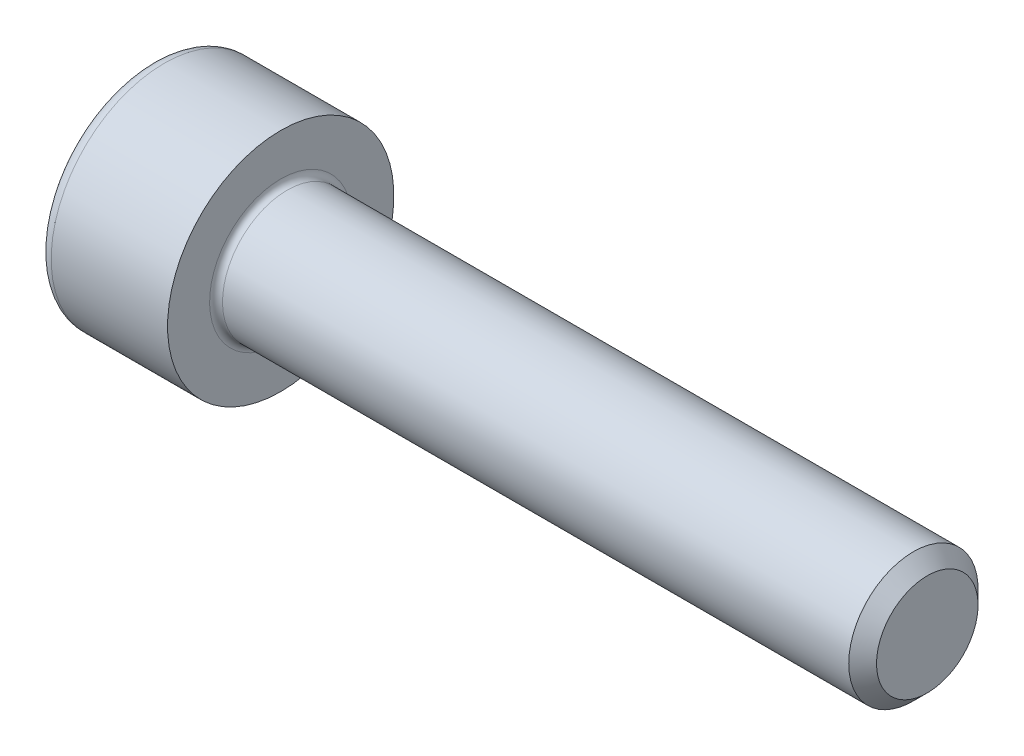
ISO-10303-21;
HEADER;
FILE_DESCRIPTION(('STEP AP214'),'2;1');
FILE_NAME('part.step','',(''),(''),'','','');
FILE_SCHEMA(('AUTOMOTIVE_DESIGN { 1 0 10303 214 1 1 1 1 }'));
ENDSEC;
DATA;
#1=APPLICATION_CONTEXT('core data for automotive mechanical design processes');
#2=APPLICATION_PROTOCOL_DEFINITION('international standard','automotive_design',2000,#1);
#3=PRODUCT_CONTEXT('',#1,'mechanical');
#4=PRODUCT('Part','Part','',(#3));
#5=PRODUCT_RELATED_PRODUCT_CATEGORY('part','',(#4));
#6=PRODUCT_DEFINITION_FORMATION('','',#4);
#7=PRODUCT_DEFINITION_CONTEXT('part definition',#1,'design');
#8=PRODUCT_DEFINITION('design','',#6,#7);
#9=PRODUCT_DEFINITION_SHAPE('','',#8);
#10=(LENGTH_UNIT() NAMED_UNIT(*) SI_UNIT(.MILLI.,.METRE.));
#11=(NAMED_UNIT(*) PLANE_ANGLE_UNIT() SI_UNIT($,.RADIAN.));
#12=(NAMED_UNIT(*) SI_UNIT($,.STERADIAN.) SOLID_ANGLE_UNIT());
#13=UNCERTAINTY_MEASURE_WITH_UNIT(LENGTH_MEASURE(1.E-05),#10,'distance_accuracy_value','');
#14=(GEOMETRIC_REPRESENTATION_CONTEXT(3) GLOBAL_UNCERTAINTY_ASSIGNED_CONTEXT((#13)) GLOBAL_UNIT_ASSIGNED_CONTEXT((#10,
#11,#12)) REPRESENTATION_CONTEXT('',''));
#15=CARTESIAN_POINT('',(0.,0.,0.));
#16=DIRECTION('',(0.,0.,1.));
#17=DIRECTION('',(1.,0.,0.));
#18=AXIS2_PLACEMENT_3D('',#15,#16,#17);
#19=CARTESIAN_POINT('',(-3.99999999999999,-1.5,0.866025403784439));
#20=DIRECTION('',(0.,-0.5,0.866025403784439));
#21=DIRECTION('',(0.,-0.866025403784439,-0.5));
#22=AXIS2_PLACEMENT_3D('',#19,#20,#21);
#23=PLANE('',#22);
#24=DIRECTION('',(1.,0.,0.));
#25=VECTOR('',#24,1.);
#26=CARTESIAN_POINT('',(-3.99999999999999,-1.5,0.866025403784438));
#27=LINE('',#26,#25);
#28=CARTESIAN_POINT('',(-1.9999999875116,-1.49999996248841,0.866025425441764));
#29=VERTEX_POINT('',#28);
#30=CARTESIAN_POINT('',(-3.99999999999999,-1.5,0.866025403784438));
#31=VERTEX_POINT('',#30);
#32=EDGE_CURVE('E80',#29,#31,#27,.F.);
#33=ORIENTED_EDGE('',*,*,#32,.T.);
#34=DIRECTION('',(0.,-0.866025403784439,-0.5));
#35=VECTOR('',#34,1.);
#36=CARTESIAN_POINT('',(-3.99999999999999,-1.5,0.866025403784439));
#37=LINE('',#36,#35);
#38=CARTESIAN_POINT('',(-3.99999999999999,0.,1.73205080756888));
#39=VERTEX_POINT('',#38);
#40=EDGE_CURVE('E92',#39,#31,#37,.T.);
#41=ORIENTED_EDGE('',*,*,#40,.F.);
#42=DIRECTION('',(1.,0.,0.));
#43=VECTOR('',#42,1.);
#44=CARTESIAN_POINT('',(-3.99999999999999,0.,1.73205080756888));
#45=LINE('',#44,#43);
#46=CARTESIAN_POINT('',(-1.99999999616734,1.1544371027462E-08,1.73205080090373));
#47=VERTEX_POINT('',#46);
#48=EDGE_CURVE('E75',#39,#47,#45,.T.);
#49=ORIENTED_EDGE('',*,*,#48,.T.);
#50=CARTESIAN_POINT('',(-2.0000000036529,-1.65452383767762E-08,1.73205077636141));
#51=CARTESIAN_POINT('',(-1.97802165551049,-0.0659159370945961,1.69399421576589));
#52=CARTESIAN_POINT('',(-1.95803350191732,-0.132400840326687,1.65560914468082));
#53=CARTESIAN_POINT('',(-1.92314478353661,-0.266521785986581,1.57817438477414));
#54=CARTESIAN_POINT('',(-1.90825655970802,-0.334160210700997,1.53912332052136));
#55=CARTESIAN_POINT('',(-1.88508196574067,-0.468598851547326,1.46150513394661));
#56=CARTESIAN_POINT('',(-1.87664133785152,-0.535378388350384,1.42294995079267));
#57=CARTESIAN_POINT('',(-1.86656687487254,-0.669251517633968,1.34565826385097));
#58=CARTESIAN_POINT('',(-1.86492469525819,-0.736344623856523,1.306922040805));
#59=CARTESIAN_POINT('',(-1.86834971897684,-0.861700886375207,1.23454756882786));
#60=CARTESIAN_POINT('',(-1.87257596506166,-0.919982853423761,1.20089845948638));
#61=CARTESIAN_POINT('',(-1.88596797480089,-1.03616709952449,1.13381945374144));
#62=CARTESIAN_POINT('',(-1.8951383086573,-1.09406897702674,1.10038978917291));
#63=CARTESIAN_POINT('',(-1.91806236794526,-1.21049257361669,1.03317259433674));
#64=CARTESIAN_POINT('',(-1.93191322160908,-1.2689995651649,0.999393567018157));
#65=CARTESIAN_POINT('',(-1.96334880368776,-1.38514116907785,0.932339180737391));
#66=CARTESIAN_POINT('',(-1.98092615073863,-1.44277726820166,0.899062963394458));
#67=CARTESIAN_POINT('',(-1.99999997500775,-1.49999992497686,0.866025447099069));
#68=B_SPLINE_CURVE_WITH_KNOTS('',3,(#50,#51,#52,#53,#54,#55,#56,#57,#58,#59,#60,#61,#62,#63,#64,
#65,#66,#67),.UNSPECIFIED.,.F.,.F.,(4,2,2,2,2,2,2,2,4),(0.,0.237762010068717,0.47609536514977,
0.708530707694851,0.940680670630639,1.14278081105053,1.34506808934202,1.55184112958895,
1.75820836194058),.UNSPECIFIED.);
#69=EDGE_CURVE('E21',#47,#29,#68,.T.);
#70=ORIENTED_EDGE('',*,*,#69,.T.);
#71=EDGE_LOOP('',(#33,#41,#49,#70));
#72=FACE_BOUND('',#71,.T.);
#73=ADVANCED_FACE('F17',(#72),#23,.F.);
#74=CARTESIAN_POINT('',(-3.99999999999999,-1.5,-0.866025403784438));
#75=DIRECTION('',(0.,-1.,0.));
#76=DIRECTION('',(0.,0.,-1.));
#77=AXIS2_PLACEMENT_3D('',#74,#75,#76);
#78=PLANE('',#77);
#79=DIRECTION('',(1.,0.,0.));
#80=VECTOR('',#79,1.);
#81=CARTESIAN_POINT('',(-3.99999999999999,-1.5,-0.866025403784441));
#82=LINE('',#81,#80);
#83=CARTESIAN_POINT('',(-1.99999998751514,-1.5,-0.866025360482052));
#84=VERTEX_POINT('',#83);
#85=CARTESIAN_POINT('',(-3.99999999999999,-1.5,-0.86602540378444));
#86=VERTEX_POINT('',#85);
#87=EDGE_CURVE('E251',#84,#86,#82,.F.);
#88=ORIENTED_EDGE('',*,*,#87,.T.);
#89=DIRECTION('',(0.,0.,-1.));
#90=VECTOR('',#89,1.);
#91=CARTESIAN_POINT('',(-3.99999999999999,-1.5,-0.866025403784438));
#92=LINE('',#91,#90);
#93=EDGE_CURVE('E91',#31,#86,#92,.T.);
#94=ORIENTED_EDGE('',*,*,#93,.F.);
#95=ORIENTED_EDGE('',*,*,#32,.F.);
#96=CARTESIAN_POINT('',(-2.00000003229821,-1.49999996249205,0.866025430549019));
#97=CARTESIAN_POINT('',(-1.97802167511814,-1.49999998652883,0.789912288388086));
#98=CARTESIAN_POINT('',(-1.95803351677338,-1.4999999963895,0.713142136383564));
#99=CARTESIAN_POINT('',(-1.92314479276488,-1.50000000361918,0.558272606729808));
#100=CARTESIAN_POINT('',(-1.90825656806336,-1.50000000095811,0.48017047824301));
#101=CARTESIAN_POINT('',(-1.88508197154335,-1.4999999990656,0.324934102626153));
#102=CARTESIAN_POINT('',(-1.87664134197457,-1.49999999975092,0.247823733904203));
#103=CARTESIAN_POINT('',(-1.86656687616511,-1.50000000024878,0.0932403557142807));
#104=CARTESIAN_POINT('',(-1.86492469540277,-1.50000000006238,0.015767907728965));
#105=CARTESIAN_POINT('',(-1.86834971730463,-1.49999999994569,-0.128981041062148));
#106=CARTESIAN_POINT('',(-1.87257596276158,-1.49999999998536,-0.196279262652278));
#107=CARTESIAN_POINT('',(-1.88596797173955,-1.50000000001465,-0.33043727989842));
#108=CARTESIAN_POINT('',(-1.89513830546149,-1.50000000000422,-0.397296611884692));
#109=CARTESIAN_POINT('',(-1.91806236493992,-1.49999999999568,-0.531731007494158));
#110=CARTESIAN_POINT('',(-1.93191321895245,-1.49999999999784,-0.599289065215861));
#111=CARTESIAN_POINT('',(-1.96334880210506,-1.50000000000215,-0.733397843892968));
#112=CARTESIAN_POINT('',(-1.98092614988199,-1.5000000000043,-0.799950281609664));
#113=CARTESIAN_POINT('',(-1.99999997501448,-1.5,-0.866025317178483));
#114=B_SPLINE_CURVE_WITH_KNOTS('',3,(#96,#97,#98,#99,#100,#101,#102,#103,#104,#105,#106,#107,
#108,#109,#110,#111,#112,#113),.UNSPECIFIED.,.F.,.F.,(4,2,2,2,2,2,2,2,4),(0.,0.237762017394818,
0.476095379541442,0.70853072814728,0.940680697255616,1.1427808461417,1.34506813284411,
1.55184118234343,1.75820842401597),.UNSPECIFIED.);
#115=EDGE_CURVE('E85',#29,#84,#114,.T.);
#116=ORIENTED_EDGE('',*,*,#115,.T.);
#117=EDGE_LOOP('',(#88,#94,#95,#116));
#118=FACE_BOUND('',#117,.T.);
#119=ADVANCED_FACE('F89',(#118),#78,.F.);
#120=CARTESIAN_POINT('',(-3.99999999999999,0.,1.73205080756888));
#121=DIRECTION('',(0.,0.500000000000001,0.866025403784438));
#122=DIRECTION('',(0.,-0.866025403784438,0.500000000000001));
#123=AXIS2_PLACEMENT_3D('',#120,#121,#122);
#124=PLANE('',#123);
#125=ORIENTED_EDGE('',*,*,#48,.F.);
#126=DIRECTION('',(0.,-0.866025403784438,0.500000000000001));
#127=VECTOR('',#126,1.);
#128=CARTESIAN_POINT('',(-3.99999999999999,0.,1.73205080756888));
#129=LINE('',#128,#127);
#130=CARTESIAN_POINT('',(-3.99999999999999,1.5,0.866025403784438));
#131=VERTEX_POINT('',#130);
#132=EDGE_CURVE('E259',#131,#39,#129,.T.);
#133=ORIENTED_EDGE('',*,*,#132,.F.);
#134=DIRECTION('',(1.,0.,0.));
#135=VECTOR('',#134,1.);
#136=CARTESIAN_POINT('',(-3.99999999999999,1.5,0.866025403784437));
#137=LINE('',#136,#135);
#138=CARTESIAN_POINT('',(-1.99999998751756,1.5,0.866025360490418));
#139=VERTEX_POINT('',#138);
#140=EDGE_CURVE('E86',#131,#139,#137,.T.);
#141=ORIENTED_EDGE('',*,*,#140,.T.);
#142=CARTESIAN_POINT('',(-2.00000003228594,1.50000000444081,0.866025357934829));
#143=CARTESIAN_POINT('',(-1.97802167510924,1.43408410176221,0.904081949829615));
#144=CARTESIAN_POINT('',(-1.95803351676374,1.36759920478545,0.942467034375812));
#145=CARTESIAN_POINT('',(-1.92314479275142,1.23347826141233,1.0199018054796));
#146=CARTESIAN_POINT('',(-1.90825656804699,1.16583983270569,1.05895286742996));
#147=CARTESIAN_POINT('',(-1.8850819715323,1.03140118688335,1.13657105360094));
#148=CARTESIAN_POINT('',(-1.87664134196848,0.964621649034505,1.17512623854522));
#149=CARTESIAN_POINT('',(-1.86656687616455,0.830748516805254,1.25241792804958));
#150=CARTESIAN_POINT('',(-1.8649246954026,0.76365540868363,1.29115415186927));
#151=CARTESIAN_POINT('',(-1.86834971741842,0.638299137651945,1.36352862855935));
#152=CARTESIAN_POINT('',(-1.87257596336653,0.580017163984809,1.39717774179075));
#153=CARTESIAN_POINT('',(-1.88596797400307,0.463832904691232,1.4642567552033));
#154=CARTESIAN_POINT('',(-1.89513830889401,0.405931020614708,1.49768642354943));
#155=CARTESIAN_POINT('',(-1.91806237128749,0.289507410593357,1.56490362612543));
#156=CARTESIAN_POINT('',(-1.93191322706717,0.231000412195435,1.59868265740244));
#157=CARTESIAN_POINT('',(-1.96334881413851,0.11485879478155,1.66573705148544));
#158=CARTESIAN_POINT('',(-1.98092616406467,0.0572226890061457,1.69901327267239));
#159=CARTESIAN_POINT('',(-1.99999999145816,2.56719139976172E-08,1.73205079274719));
#160=B_SPLINE_CURVE_WITH_KNOTS('',3,(#142,#143,#144,#145,#146,#147,#148,#149,#150,#151,#152,
#153,#154,#155,#156,#157,#158,#159),.UNSPECIFIED.,.F.,.F.,(4,2,2,2,2,2,2,2,4),(0.,
0.237762017448861,0.47609537965735,0.708530728202091,0.940680697243783,1.14278086056226,
1.34506816175055,1.55184122648755,1.75820848328163),.UNSPECIFIED.);
#161=EDGE_CURVE('E122',#139,#47,#160,.T.);
#162=ORIENTED_EDGE('',*,*,#161,.T.);
#163=EDGE_LOOP('',(#125,#133,#141,#162));
#164=FACE_BOUND('',#163,.T.);
#165=ADVANCED_FACE('F115',(#164),#124,.F.);
#166=CARTESIAN_POINT('',(-3.99999999999999,0.,-1.73205080756888));
#167=DIRECTION('',(0.,-0.5,-0.866025403784439));
#168=DIRECTION('',(0.,0.866025403784439,-0.5));
#169=AXIS2_PLACEMENT_3D('',#166,#167,#168);
#170=PLANE('',#169);
#171=DIRECTION('',(1.,0.,0.));
#172=VECTOR('',#171,1.);
#173=CARTESIAN_POINT('',(-3.99999999999999,0.,-1.73205080756888));
#174=LINE('',#173,#172);
#175=CARTESIAN_POINT('',(-1.99999999231927,-5.19153402602735E-08,-1.73205079423868));
#176=VERTEX_POINT('',#175);
#177=CARTESIAN_POINT('',(-3.99999999999999,0.,-1.73205080756888));
#178=VERTEX_POINT('',#177);
#179=EDGE_CURVE('E127',#176,#178,#174,.F.);
#180=ORIENTED_EDGE('',*,*,#179,.T.);
#181=DIRECTION('',(0.,0.866025403784439,-0.5));
#182=VECTOR('',#181,1.);
#183=CARTESIAN_POINT('',(-3.99999999999999,0.,-1.73205080756888));
#184=LINE('',#183,#182);
#185=EDGE_CURVE('E40',#86,#178,#184,.T.);
#186=ORIENTED_EDGE('',*,*,#185,.F.);
#187=ORIENTED_EDGE('',*,*,#87,.F.);
#188=CARTESIAN_POINT('',(-2.0000000322865,-1.50000000440859,-0.86602535793755));
#189=CARTESIAN_POINT('',(-1.97802167511012,-1.43408410175135,-0.904081949830185));
#190=CARTESIAN_POINT('',(-1.95803351676731,-1.36759920479283,-0.942467034370029));
#191=CARTESIAN_POINT('',(-1.92314479276111,-1.2334782614559,-1.01990180545598));
#192=CARTESIAN_POINT('',(-1.90825656805995,-1.16583983276724,-1.05895286739483));
#193=CARTESIAN_POINT('',(-1.88508197154098,-1.03140118694701,-1.13657105356379));
#194=CARTESIAN_POINT('',(-1.87664134197288,-0.964621649081852,-1.17512623851778));
#195=CARTESIAN_POINT('',(-1.86656687616458,-0.83074851681681,-1.25241792804302));
#196=CARTESIAN_POINT('',(-1.86492469540271,-0.763655408675709,-1.29115415187387));
#197=CARTESIAN_POINT('',(-1.86834971730531,-0.638299141795081,-1.36352862616728));
#198=CARTESIAN_POINT('',(-1.8725759627625,-0.58001717228952,-1.39717773699602));
#199=CARTESIAN_POINT('',(-1.88596797174072,-0.463832921249992,-1.4642567456431));
#200=CARTESIAN_POINT('',(-1.89513830546267,-0.405931041265777,-1.49768641162654));
#201=CARTESIAN_POINT('',(-1.91806236494091,-0.289507439523717,-1.56490360942248));
#202=CARTESIAN_POINT('',(-1.93191321895324,-0.231000445308716,-1.59868263828448));
#203=CARTESIAN_POINT('',(-1.96334880210526,-0.114858836108465,-1.66573702762534));
#204=CARTESIAN_POINT('',(-1.9809261498818,-0.0572227343643234,-1.69901324648484));
#205=CARTESIAN_POINT('',(-1.99999997501386,-7.50048201940328E-08,-1.73205076426483));
#206=B_SPLINE_CURVE_WITH_KNOTS('',3,(#188,#189,#190,#191,#192,#193,#194,#195,#196,#197,#198,
#199,#200,#201,#202,#203,#204,#205),.UNSPECIFIED.,.F.,.F.,(4,2,2,2,2,2,2,2,4),(0.,
0.23776201739182,0.476095379535552,0.708530728138914,0.940680697244729,1.14278084612681,
1.34506813282524,1.55184118232019,1.75820842398835),.UNSPECIFIED.);
#207=EDGE_CURVE('E98',#84,#176,#206,.T.);
#208=ORIENTED_EDGE('',*,*,#207,.T.);
#209=EDGE_LOOP('',(#180,#186,#187,#208));
#210=FACE_BOUND('',#209,.T.);
#211=ADVANCED_FACE('F118',(#210),#170,.F.);
#212=CARTESIAN_POINT('',(-3.99999999999999,1.5,0.866025403784437));
#213=DIRECTION('',(0.,1.,0.));
#214=DIRECTION('',(0.,0.,1.));
#215=AXIS2_PLACEMENT_3D('',#212,#213,#214);
#216=PLANE('',#215);
#217=ORIENTED_EDGE('',*,*,#140,.F.);
#218=DIRECTION('',(0.,0.,1.));
#219=VECTOR('',#218,1.);
#220=CARTESIAN_POINT('',(-3.99999999999999,1.5,0.866025403784437));
#221=LINE('',#220,#219);
#222=CARTESIAN_POINT('',(-3.99999999999999,1.5,-0.86602540378444));
#223=VERTEX_POINT('',#222);
#224=EDGE_CURVE('E241',#223,#131,#221,.T.);
#225=ORIENTED_EDGE('',*,*,#224,.F.);
#226=DIRECTION('',(1.,0.,0.));
#227=VECTOR('',#226,1.);
#228=CARTESIAN_POINT('',(-3.99999999999999,1.5,-0.86602540378444));
#229=LINE('',#228,#227);
#230=CARTESIAN_POINT('',(-2.00000000001484,1.5,-0.866025403782285));
#231=VERTEX_POINT('',#230);
#232=EDGE_CURVE('E228',#223,#231,#229,.T.);
#233=ORIENTED_EDGE('',*,*,#232,.T.);
#234=CARTESIAN_POINT('',(-2.00000000001257,1.50000000000273,-0.866025403780606));
#235=CARTESIAN_POINT('',(-1.97802165886293,1.50000000000098,-0.789912260493061));
#236=CARTESIAN_POINT('',(-1.95803350784681,1.50000000000026,-0.713142109635523));
#237=CARTESIAN_POINT('',(-1.92314479057624,1.49999999999973,-0.558272584114995));
#238=CARTESIAN_POINT('',(-1.90825656528006,1.49999999999993,-0.480170458616052));
#239=CARTESIAN_POINT('',(-1.88508196922304,1.50000000000007,-0.324934088047349));
#240=CARTESIAN_POINT('',(-1.87664134070256,1.50000000000002,-0.247823721391418));
#241=CARTESIAN_POINT('',(-1.86656687609283,1.49999999999998,-0.0932403476176745));
#242=CARTESIAN_POINT('',(-1.86492469547459,1.49999999999999,-0.0157679019828527));
#243=CARTESIAN_POINT('',(-1.86834971743715,1.5,0.12898104429369));
#244=CARTESIAN_POINT('',(-1.87257596298732,1.5,0.196279265710841));
#245=CARTESIAN_POINT('',(-1.88596797209475,1.5,0.330437282658472));
#246=CARTESIAN_POINT('',(-1.89513830585714,1.5,0.397296614518769));
#247=CARTESIAN_POINT('',(-1.91806236535705,1.5,0.531731009618976));
#248=CARTESIAN_POINT('',(-1.93191321933312,1.5,0.59928906696045));
#249=CARTESIAN_POINT('',(-1.96334880234726,1.5,0.733397844805802));
#250=CARTESIAN_POINT('',(-1.98092615001771,1.5,0.799950282072011));
#251=CARTESIAN_POINT('',(-1.99999997501965,1.5,0.866025317196399));
#252=B_SPLINE_CURVE_WITH_KNOTS('',3,(#234,#235,#236,#237,#238,#239,#240,#241,#242,#243,#244,
#245,#246,#247,#248,#249,#250,#251),.UNSPECIFIED.,.F.,.F.,(4,2,2,2,2,2,2,2,4),(0.,
0.237762008585654,0.476095362595392,0.708530704532813,0.940680666692571,1.14278081505591,
1.3450681014095,1.55184114976991,1.75820839005551),.UNSPECIFIED.);
#253=EDGE_CURVE('E99',#231,#139,#252,.T.);
#254=ORIENTED_EDGE('',*,*,#253,.T.);
#255=EDGE_LOOP('',(#217,#225,#233,#254));
#256=FACE_BOUND('',#255,.T.);
#257=ADVANCED_FACE('F137',(#256),#216,.F.);
#258=CARTESIAN_POINT('',(-2.00599999993756,0.,0.));
#259=DIRECTION('',(-1.,0.,0.));
#260=DIRECTION('',(0.,0.,1.));
#261=AXIS2_PLACEMENT_3D('',#258,#259,#260);
#262=CONICAL_SURFACE('',#261,1.74244311227767,1.04719755112663);
#263=CARTESIAN_POINT('',(-0.999999999976353,-5.6843418860808E-11,0.));
#264=VERTEX_POINT('',#263);
#265=VERTEX_LOOP('',#264);
#266=FACE_BOUND('',#265,.T.);
#267=ORIENTED_EDGE('',*,*,#253,.F.);
#268=CARTESIAN_POINT('',(-2.00000000001422,1.49999999999627,-0.866025403786596));
#269=CARTESIAN_POINT('',(-1.97802165885292,1.43408408431542,-0.904081975448814));
#270=CARTESIAN_POINT('',(-1.95803350782755,1.36759918338794,-0.942467050896341));
#271=CARTESIAN_POINT('',(-1.92314479054351,1.23347823994494,-1.01990181369712));
#272=CARTESIAN_POINT('',(-1.90825656524344,1.16583981513555,-1.05895287646838));
#273=CARTESIAN_POINT('',(-1.88508196919891,1.03140117462586,-1.13657106175614));
#274=CARTESIAN_POINT('',(-1.8766413406883,0.964621638239401,-1.17512624506522));
#275=CARTESIAN_POINT('',(-1.86656687609048,0.830748509619987,-1.2524179319109));
#276=CARTESIAN_POINT('',(-1.86492469547398,0.763655403645579,-1.29115415470599));
#277=CARTESIAN_POINT('',(-1.8683497176662,0.638299130702508,-1.36352863263428));
#278=CARTESIAN_POINT('',(-1.87257596419906,0.580017153008408,-1.39717774814487));
#279=CARTESIAN_POINT('',(-1.88596797662375,0.463832885713951,-1.46425676614293));
#280=CARTESIAN_POINT('',(-1.89513831272391,0.40593099766408,-1.49768643679511));
#281=CARTESIAN_POINT('',(-1.91806237805289,0.289507379817978,-1.56490364389859));
#282=CARTESIAN_POINT('',(-1.93191323556249,0.231000377569928,-1.59868267739598));
#283=CARTESIAN_POINT('',(-1.96334882641215,0.114858752669525,-1.66573707579634));
#284=CARTESIAN_POINT('',(-1.98092617837992,0.0572226432562808,-1.69901329908112));
#285=CARTESIAN_POINT('',(-2.00000000790258,-2.36613446850149E-08,-1.73205082122976));
#286=B_SPLINE_CURVE_WITH_KNOTS('',3,(#268,#269,#270,#271,#272,#273,#274,#275,#276,#277,#278,
#279,#280,#281,#282,#283,#284,#285),.UNSPECIFIED.,.F.,.F.,(4,2,2,2,2,2,2,2,4),(0.,
0.237762008701382,0.476095362841596,0.708530704662099,0.940680666694218,1.14278084391053,
1.34506815922383,1.55184123804786,1.75820850856515),.UNSPECIFIED.);
#287=EDGE_CURVE('E128',#231,#176,#286,.T.);
#288=ORIENTED_EDGE('',*,*,#287,.T.);
#289=ORIENTED_EDGE('',*,*,#207,.F.);
#290=ORIENTED_EDGE('',*,*,#115,.F.);
#291=ORIENTED_EDGE('',*,*,#69,.F.);
#292=ORIENTED_EDGE('',*,*,#161,.F.);
#293=EDGE_LOOP('',(#267,#288,#289,#290,#291,#292));
#294=FACE_BOUND('',#293,.T.);
#295=ADVANCED_FACE('F96',(#266,#294),#262,.F.);
#296=CARTESIAN_POINT('',(-3.99999999999999,1.5,-0.86602540378444));
#297=DIRECTION('',(0.,0.5,-0.866025403784439));
#298=DIRECTION('',(0.,0.866025403784439,0.5));
#299=AXIS2_PLACEMENT_3D('',#296,#297,#298);
#300=PLANE('',#299);
#301=ORIENTED_EDGE('',*,*,#232,.F.);
#302=DIRECTION('',(0.,0.866025403784438,0.5));
#303=VECTOR('',#302,1.);
#304=CARTESIAN_POINT('',(-3.99999999999999,0.,-1.73205080756888));
#305=LINE('',#304,#303);
#306=EDGE_CURVE('E247',#178,#223,#305,.T.);
#307=ORIENTED_EDGE('',*,*,#306,.F.);
#308=ORIENTED_EDGE('',*,*,#179,.F.);
#309=ORIENTED_EDGE('',*,*,#287,.F.);
#310=EDGE_LOOP('',(#301,#307,#308,#309));
#311=FACE_BOUND('',#310,.T.);
#312=ADVANCED_FACE('F146',(#311),#300,.F.);
#313=CARTESIAN_POINT('',(-3.99999999999999,2.61602540378444,0.));
#314=DIRECTION('',(-1.,0.,0.));
#315=DIRECTION('',(0.,-1.,0.));
#316=AXIS2_PLACEMENT_3D('',#313,#314,#315);
#317=PLANE('',#316);
#318=ORIENTED_EDGE('',*,*,#185,.T.);
#319=ORIENTED_EDGE('',*,*,#306,.T.);
#320=ORIENTED_EDGE('',*,*,#224,.T.);
#321=ORIENTED_EDGE('',*,*,#132,.T.);
#322=ORIENTED_EDGE('',*,*,#40,.T.);
#323=ORIENTED_EDGE('',*,*,#93,.T.);
#324=EDGE_LOOP('',(#318,#319,#320,#321,#322,#323));
#325=FACE_BOUND('',#324,.T.);
#326=CARTESIAN_POINT('',(-3.99999999999999,0.,0.));
#327=DIRECTION('',(1.,0.,0.));
#328=DIRECTION('',(0.,1.,0.));
#329=AXIS2_PLACEMENT_3D('',#326,#327,#328);
#330=CIRCLE('',#329,3.1);
#331=CARTESIAN_POINT('',(-3.99999999999999,3.1,0.));
#332=VERTEX_POINT('',#331);
#333=EDGE_CURVE('E215',#332,#332,#330,.T.);
#334=ORIENTED_EDGE('',*,*,#333,.F.);
#335=EDGE_LOOP('',(#334));
#336=FACE_BOUND('',#335,.T.);
#337=ADVANCED_FACE('F202',(#325,#336),#317,.T.);
#338=CARTESIAN_POINT('',(-3.59999999999999,0.,0.));
#339=DIRECTION('',(1.,0.,0.));
#340=DIRECTION('',(0.,0.,-1.));
#341=AXIS2_PLACEMENT_3D('',#338,#339,#340);
#342=TOROIDAL_SURFACE('',#341,3.1,0.4);
#343=CARTESIAN_POINT('',(-3.59999999999999,0.,0.));
#344=DIRECTION('',(1.,0.,0.));
#345=DIRECTION('',(0.,1.,0.));
#346=AXIS2_PLACEMENT_3D('',#343,#344,#345);
#347=CIRCLE('',#346,3.5);
#348=CARTESIAN_POINT('',(-3.59999999999999,3.5,0.));
#349=VERTEX_POINT('',#348);
#350=EDGE_CURVE('E277',#349,#349,#347,.T.);
#351=ORIENTED_EDGE('',*,*,#350,.F.);
#352=EDGE_LOOP('',(#351));
#353=FACE_BOUND('',#352,.T.);
#354=ORIENTED_EDGE('',*,*,#333,.T.);
#355=EDGE_LOOP('',(#354));
#356=FACE_BOUND('',#355,.T.);
#357=ADVANCED_FACE('F196',(#353,#356),#342,.T.);
#358=CARTESIAN_POINT('',(-2.,0.,0.));
#359=DIRECTION('',(1.,0.,0.));
#360=DIRECTION('',(0.,1.,0.));
#361=AXIS2_PLACEMENT_3D('',#358,#359,#360);
#362=CYLINDRICAL_SURFACE('',#361,3.5);
#363=ORIENTED_EDGE('',*,*,#350,.T.);
#364=EDGE_LOOP('',(#363));
#365=FACE_BOUND('',#364,.T.);
#366=CARTESIAN_POINT('',(0.,0.,0.));
#367=DIRECTION('',(1.,0.,0.));
#368=DIRECTION('',(0.,1.,0.));
#369=AXIS2_PLACEMENT_3D('',#366,#367,#368);
#370=CIRCLE('',#369,3.5);
#371=CARTESIAN_POINT('',(0.,3.5,0.));
#372=VERTEX_POINT('',#371);
#373=EDGE_CURVE('E275',#372,#372,#370,.T.);
#374=ORIENTED_EDGE('',*,*,#373,.F.);
#375=EDGE_LOOP('',(#374));
#376=FACE_BOUND('',#375,.T.);
#377=ADVANCED_FACE('F192',(#365,#376),#362,.T.);
#378=CARTESIAN_POINT('',(20.,1.,0.));
#379=DIRECTION('',(1.,0.,0.));
#380=DIRECTION('',(0.,1.,0.));
#381=AXIS2_PLACEMENT_3D('',#378,#379,#380);
#382=PLANE('',#381);
#383=CARTESIAN_POINT('',(19.9999999999818,0.,0.));
#384=DIRECTION('',(-1.,0.,0.));
#385=DIRECTION('',(0.,0.,1.));
#386=AXIS2_PLACEMENT_3D('',#383,#384,#385);
#387=CIRCLE('',#386,1.57058500002449);
#388=CARTESIAN_POINT('',(19.9999999999818,0.,1.57058500002449));
#389=VERTEX_POINT('',#388);
#390=EDGE_CURVE('E273',#389,#389,#387,.T.);
#391=ORIENTED_EDGE('',*,*,#390,.F.);
#392=EDGE_LOOP('',(#391));
#393=FACE_BOUND('',#392,.T.);
#394=ADVANCED_FACE('F189',(#393),#382,.T.);
#395=CARTESIAN_POINT('',(0.,2.75,0.));
#396=DIRECTION('',(1.,0.,0.));
#397=DIRECTION('',(0.,1.,0.));
#398=AXIS2_PLACEMENT_3D('',#395,#396,#397);
#399=PLANE('',#398);
#400=CARTESIAN_POINT('',(0.,0.,0.));
#401=DIRECTION('',(1.,0.,0.));
#402=DIRECTION('',(0.,1.,0.));
#403=AXIS2_PLACEMENT_3D('',#400,#401,#402);
#404=CIRCLE('',#403,2.2);
#405=CARTESIAN_POINT('',(0.,2.2,0.));
#406=VERTEX_POINT('',#405);
#407=EDGE_CURVE('E176',#406,#406,#404,.F.);
#408=ORIENTED_EDGE('',*,*,#407,.T.);
#409=EDGE_LOOP('',(#408));
#410=FACE_BOUND('',#409,.T.);
#411=ORIENTED_EDGE('',*,*,#373,.T.);
#412=EDGE_LOOP('',(#411));
#413=FACE_BOUND('',#412,.T.);
#414=ADVANCED_FACE('F180',(#410,#413),#399,.T.);
#415=CARTESIAN_POINT('',(19.5705850000536,0.,0.));
#416=DIRECTION('',(-1.,0.,0.));
#417=DIRECTION('',(0.,0.,1.));
#418=AXIS2_PLACEMENT_3D('',#415,#416,#417);
#419=CONICAL_SURFACE('',#418,1.99999999995271,0.785398163397448);
#420=ORIENTED_EDGE('',*,*,#390,.T.);
#421=EDGE_LOOP('',(#420));
#422=FACE_BOUND('',#421,.T.);
#423=CARTESIAN_POINT('',(19.570585,0.,0.));
#424=DIRECTION('',(1.,0.,0.));
#425=DIRECTION('',(0.,1.,0.));
#426=AXIS2_PLACEMENT_3D('',#423,#424,#425);
#427=CIRCLE('',#426,2.);
#428=CARTESIAN_POINT('',(19.570585,2.,0.));
#429=VERTEX_POINT('',#428);
#430=EDGE_CURVE('E31',#429,#429,#427,.F.);
#431=ORIENTED_EDGE('',*,*,#430,.F.);
#432=EDGE_LOOP('',(#431));
#433=FACE_BOUND('',#432,.T.);
#434=ADVANCED_FACE('F158',(#422,#433),#419,.T.);
#435=CARTESIAN_POINT('',(0.200000000000002,0.,0.));
#436=DIRECTION('',(1.,0.,0.));
#437=DIRECTION('',(0.,0.,-1.));
#438=AXIS2_PLACEMENT_3D('',#435,#436,#437);
#439=TOROIDAL_SURFACE('',#438,2.2,0.2);
#440=CARTESIAN_POINT('',(0.200000000000002,0.,0.));
#441=DIRECTION('',(1.,0.,0.));
#442=DIRECTION('',(0.,1.,0.));
#443=AXIS2_PLACEMENT_3D('',#440,#441,#442);
#444=CIRCLE('',#443,2.);
#445=CARTESIAN_POINT('',(0.200000000000002,2.,0.));
#446=VERTEX_POINT('',#445);
#447=EDGE_CURVE('E11',#446,#446,#444,.T.);
#448=ORIENTED_EDGE('',*,*,#447,.F.);
#449=EDGE_LOOP('',(#448));
#450=FACE_BOUND('',#449,.T.);
#451=ORIENTED_EDGE('',*,*,#407,.F.);
#452=EDGE_LOOP('',(#451));
#453=FACE_BOUND('',#452,.T.);
#454=ADVANCED_FACE('F152',(#450,#453),#439,.F.);
#455=CARTESIAN_POINT('',(10.875,0.,0.));
#456=DIRECTION('',(1.,0.,0.));
#457=DIRECTION('',(0.,1.,0.));
#458=AXIS2_PLACEMENT_3D('',#455,#456,#457);
#459=CYLINDRICAL_SURFACE('',#458,2.);
#460=ORIENTED_EDGE('',*,*,#447,.T.);
#461=EDGE_LOOP('',(#460));
#462=FACE_BOUND('',#461,.T.);
#463=ORIENTED_EDGE('',*,*,#430,.T.);
#464=EDGE_LOOP('',(#463));
#465=FACE_BOUND('',#464,.T.);
#466=ADVANCED_FACE('F150',(#462,#465),#459,.T.);
#467=CLOSED_SHELL('',(#73,#119,#165,#211,#257,#295,#312,#337,#357,#377,#394,#414,#434,#454,#466));
#468=MANIFOLD_SOLID_BREP('B1',#467);
#469=ADVANCED_BREP_SHAPE_REPRESENTATION('',(#18,#468),#14);
#470=SHAPE_DEFINITION_REPRESENTATION(#9,#469);
ENDSEC;
END-ISO-10303-21;
